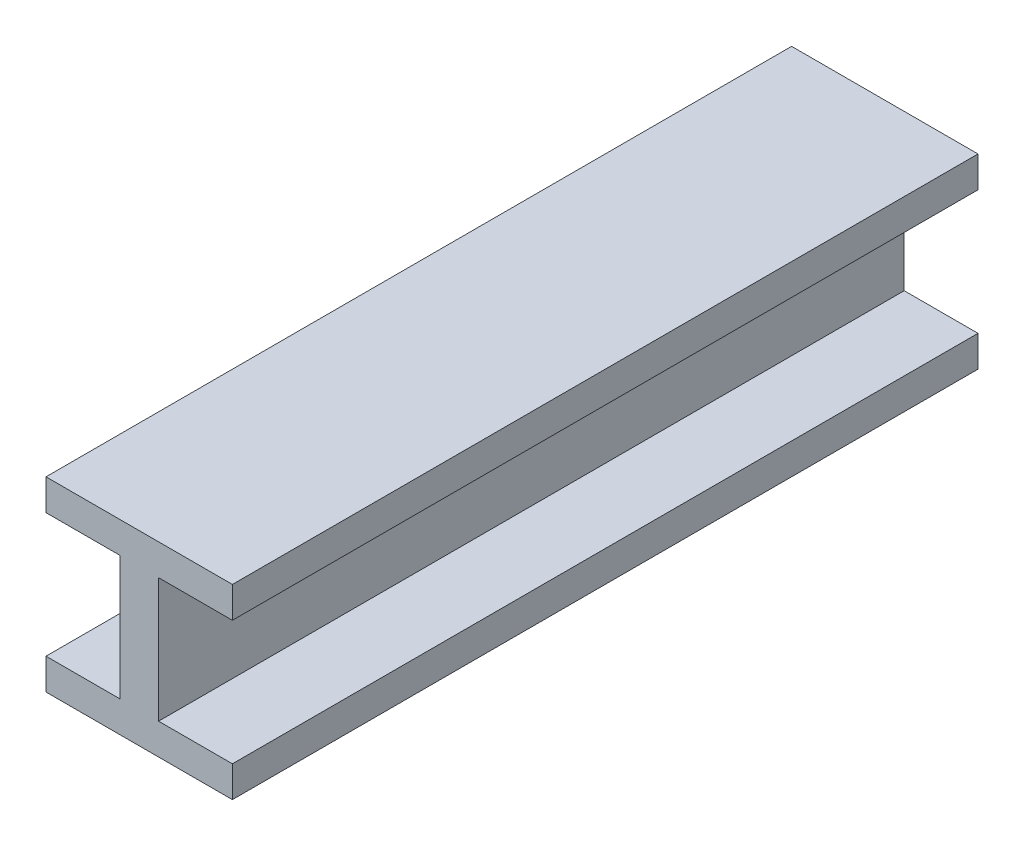
ISO-10303-21;
HEADER;
FILE_DESCRIPTION(('STEP AP214'),'2;1');
FILE_NAME('part.step','',(''),(''),'','','');
FILE_SCHEMA(('AUTOMOTIVE_DESIGN { 1 0 10303 214 1 1 1 1 }'));
ENDSEC;
DATA;
#1=APPLICATION_CONTEXT('core data for automotive mechanical design processes');
#2=APPLICATION_PROTOCOL_DEFINITION('international standard','automotive_design',2000,#1);
#3=PRODUCT_CONTEXT('',#1,'mechanical');
#4=PRODUCT('Part','Part','',(#3));
#5=PRODUCT_RELATED_PRODUCT_CATEGORY('part','',(#4));
#6=PRODUCT_DEFINITION_FORMATION('','',#4);
#7=PRODUCT_DEFINITION_CONTEXT('part definition',#1,'design');
#8=PRODUCT_DEFINITION('design','',#6,#7);
#9=PRODUCT_DEFINITION_SHAPE('','',#8);
#10=(LENGTH_UNIT() NAMED_UNIT(*) SI_UNIT(.MILLI.,.METRE.));
#11=(NAMED_UNIT(*) PLANE_ANGLE_UNIT() SI_UNIT($,.RADIAN.));
#12=(NAMED_UNIT(*) SI_UNIT($,.STERADIAN.) SOLID_ANGLE_UNIT());
#13=UNCERTAINTY_MEASURE_WITH_UNIT(LENGTH_MEASURE(1.E-05),#10,'distance_accuracy_value','');
#14=(GEOMETRIC_REPRESENTATION_CONTEXT(3) GLOBAL_UNCERTAINTY_ASSIGNED_CONTEXT((#13)) GLOBAL_UNIT_ASSIGNED_CONTEXT((#10,
#11,#12)) REPRESENTATION_CONTEXT('',''));
#15=CARTESIAN_POINT('',(0.,0.,0.));
#16=DIRECTION('',(0.,0.,1.));
#17=DIRECTION('',(1.,0.,0.));
#18=AXIS2_PLACEMENT_3D('',#15,#16,#17);
#19=CARTESIAN_POINT('',(-3.96874999999999,12.7,76.2));
#20=DIRECTION('',(0.,1.,0.));
#21=DIRECTION('',(-1.,0.,0.));
#22=AXIS2_PLACEMENT_3D('',#19,#20,#21);
#23=PLANE('',#22);
#24=DIRECTION('',(1.,0.,0.));
#25=VECTOR('',#24,1.);
#26=CARTESIAN_POINT('',(-3.96874999999999,12.7,-76.2));
#27=LINE('',#26,#25);
#28=CARTESIAN_POINT('',(-19.05,12.7,-76.2));
#29=VERTEX_POINT('',#28);
#30=CARTESIAN_POINT('',(-3.96874999999999,12.7,-76.2));
#31=VERTEX_POINT('',#30);
#32=EDGE_CURVE('E154',#29,#31,#27,.T.);
#33=ORIENTED_EDGE('',*,*,#32,.T.);
#34=DIRECTION('',(0.,0.,-1.));
#35=VECTOR('',#34,1.);
#36=CARTESIAN_POINT('',(-3.96874999999999,12.7,76.2));
#37=LINE('',#36,#35);
#38=CARTESIAN_POINT('',(-3.96874999999999,12.7,76.2));
#39=VERTEX_POINT('',#38);
#40=EDGE_CURVE('E11',#39,#31,#37,.T.);
#41=ORIENTED_EDGE('',*,*,#40,.F.);
#42=DIRECTION('',(1.,0.,0.));
#43=VECTOR('',#42,1.);
#44=CARTESIAN_POINT('',(-3.96874999999999,12.7,76.2));
#45=LINE('',#44,#43);
#46=CARTESIAN_POINT('',(-19.05,12.7,76.2));
#47=VERTEX_POINT('',#46);
#48=EDGE_CURVE('E176',#47,#39,#45,.T.);
#49=ORIENTED_EDGE('',*,*,#48,.F.);
#50=DIRECTION('',(0.,0.,-1.));
#51=VECTOR('',#50,1.);
#52=CARTESIAN_POINT('',(-19.05,12.7,76.2));
#53=LINE('',#52,#51);
#54=EDGE_CURVE('E150',#47,#29,#53,.T.);
#55=ORIENTED_EDGE('',*,*,#54,.T.);
#56=EDGE_LOOP('',(#33,#41,#49,#55));
#57=FACE_BOUND('',#56,.T.);
#58=ADVANCED_FACE('F34',(#57),#23,.F.);
#59=CARTESIAN_POINT('',(-3.96874999999999,12.7,76.2));
#60=DIRECTION('',(1.,0.,0.));
#61=DIRECTION('',(0.,0.,-1.));
#62=AXIS2_PLACEMENT_3D('',#59,#60,#61);
#63=PLANE('',#62);
#64=DIRECTION('',(0.,-1.,0.));
#65=VECTOR('',#64,1.);
#66=CARTESIAN_POINT('',(-3.96874999999999,12.7,-76.2));
#67=LINE('',#66,#65);
#68=CARTESIAN_POINT('',(-3.96874999999999,-12.7,-76.2));
#69=VERTEX_POINT('',#68);
#70=EDGE_CURVE('E157',#31,#69,#67,.T.);
#71=ORIENTED_EDGE('',*,*,#70,.T.);
#72=DIRECTION('',(0.,0.,-1.));
#73=VECTOR('',#72,1.);
#74=CARTESIAN_POINT('',(-3.96874999999999,-12.7,76.2));
#75=LINE('',#74,#73);
#76=CARTESIAN_POINT('',(-3.96874999999999,-12.7,76.2));
#77=VERTEX_POINT('',#76);
#78=EDGE_CURVE('E42',#77,#69,#75,.T.);
#79=ORIENTED_EDGE('',*,*,#78,.F.);
#80=DIRECTION('',(0.,-1.,0.));
#81=VECTOR('',#80,1.);
#82=CARTESIAN_POINT('',(-3.96874999999999,12.7,76.2));
#83=LINE('',#82,#81);
#84=EDGE_CURVE('E105',#39,#77,#83,.T.);
#85=ORIENTED_EDGE('',*,*,#84,.F.);
#86=ORIENTED_EDGE('',*,*,#40,.T.);
#87=EDGE_LOOP('',(#71,#79,#85,#86));
#88=FACE_BOUND('',#87,.T.);
#89=ADVANCED_FACE('F254',(#88),#63,.F.);
#90=CARTESIAN_POINT('',(-3.96874999999999,-12.7,76.2));
#91=DIRECTION('',(0.,-1.,0.));
#92=DIRECTION('',(1.,0.,0.));
#93=AXIS2_PLACEMENT_3D('',#90,#91,#92);
#94=PLANE('',#93);
#95=DIRECTION('',(-1.,0.,0.));
#96=VECTOR('',#95,1.);
#97=CARTESIAN_POINT('',(-3.96874999999999,-12.7,-76.2));
#98=LINE('',#97,#96);
#99=CARTESIAN_POINT('',(-19.05,-12.7,-76.2));
#100=VERTEX_POINT('',#99);
#101=EDGE_CURVE('E159',#69,#100,#98,.T.);
#102=ORIENTED_EDGE('',*,*,#101,.T.);
#103=DIRECTION('',(0.,0.,-1.));
#104=VECTOR('',#103,1.);
#105=CARTESIAN_POINT('',(-19.05,-12.7,76.2));
#106=LINE('',#105,#104);
#107=CARTESIAN_POINT('',(-19.05,-12.7,76.2));
#108=VERTEX_POINT('',#107);
#109=EDGE_CURVE('E195',#108,#100,#106,.T.);
#110=ORIENTED_EDGE('',*,*,#109,.F.);
#111=DIRECTION('',(-1.,0.,0.));
#112=VECTOR('',#111,1.);
#113=CARTESIAN_POINT('',(-3.96874999999999,-12.7,76.2));
#114=LINE('',#113,#112);
#115=EDGE_CURVE('E203',#77,#108,#114,.T.);
#116=ORIENTED_EDGE('',*,*,#115,.F.);
#117=ORIENTED_EDGE('',*,*,#78,.T.);
#118=EDGE_LOOP('',(#102,#110,#116,#117));
#119=FACE_BOUND('',#118,.T.);
#120=ADVANCED_FACE('F201',(#119),#94,.F.);
#121=CARTESIAN_POINT('',(-19.05,-12.7,76.2));
#122=DIRECTION('',(1.,0.,0.));
#123=DIRECTION('',(0.,1.,0.));
#124=AXIS2_PLACEMENT_3D('',#121,#122,#123);
#125=PLANE('',#124);
#126=DIRECTION('',(0.,-1.,0.));
#127=VECTOR('',#126,1.);
#128=CARTESIAN_POINT('',(-19.05,-12.7,-76.2));
#129=LINE('',#128,#127);
#130=CARTESIAN_POINT('',(-19.05,-19.05,-76.2));
#131=VERTEX_POINT('',#130);
#132=EDGE_CURVE('E161',#100,#131,#129,.T.);
#133=ORIENTED_EDGE('',*,*,#132,.T.);
#134=DIRECTION('',(0.,0.,-1.));
#135=VECTOR('',#134,1.);
#136=CARTESIAN_POINT('',(-19.05,-19.05,76.2));
#137=LINE('',#136,#135);
#138=CARTESIAN_POINT('',(-19.05,-19.05,76.2));
#139=VERTEX_POINT('',#138);
#140=EDGE_CURVE('E192',#139,#131,#137,.T.);
#141=ORIENTED_EDGE('',*,*,#140,.F.);
#142=DIRECTION('',(0.,-1.,0.));
#143=VECTOR('',#142,1.);
#144=CARTESIAN_POINT('',(-19.05,-12.7,76.2));
#145=LINE('',#144,#143);
#146=EDGE_CURVE('E221',#108,#139,#145,.T.);
#147=ORIENTED_EDGE('',*,*,#146,.F.);
#148=ORIENTED_EDGE('',*,*,#109,.T.);
#149=EDGE_LOOP('',(#133,#141,#147,#148));
#150=FACE_BOUND('',#149,.T.);
#151=ADVANCED_FACE('F212',(#150),#125,.F.);
#152=CARTESIAN_POINT('',(19.05,-19.05,76.2));
#153=DIRECTION('',(0.,1.,0.));
#154=DIRECTION('',(-1.,0.,0.));
#155=AXIS2_PLACEMENT_3D('',#152,#153,#154);
#156=PLANE('',#155);
#157=DIRECTION('',(1.,0.,0.));
#158=VECTOR('',#157,1.);
#159=CARTESIAN_POINT('',(19.05,-19.05,-76.2));
#160=LINE('',#159,#158);
#161=CARTESIAN_POINT('',(19.05,-19.05,-76.2));
#162=VERTEX_POINT('',#161);
#163=EDGE_CURVE('E163',#131,#162,#160,.T.);
#164=ORIENTED_EDGE('',*,*,#163,.T.);
#165=DIRECTION('',(0.,0.,-1.));
#166=VECTOR('',#165,1.);
#167=CARTESIAN_POINT('',(19.05,-19.05,76.2));
#168=LINE('',#167,#166);
#169=CARTESIAN_POINT('',(19.05,-19.05,76.2));
#170=VERTEX_POINT('',#169);
#171=EDGE_CURVE('E189',#170,#162,#168,.T.);
#172=ORIENTED_EDGE('',*,*,#171,.F.);
#173=DIRECTION('',(1.,0.,0.));
#174=VECTOR('',#173,1.);
#175=CARTESIAN_POINT('',(19.05,-19.05,76.2));
#176=LINE('',#175,#174);
#177=EDGE_CURVE('E218',#139,#170,#176,.T.);
#178=ORIENTED_EDGE('',*,*,#177,.F.);
#179=ORIENTED_EDGE('',*,*,#140,.T.);
#180=EDGE_LOOP('',(#164,#172,#178,#179));
#181=FACE_BOUND('',#180,.T.);
#182=ADVANCED_FACE('F216',(#181),#156,.F.);
#183=CARTESIAN_POINT('',(19.05,-12.7,76.2));
#184=DIRECTION('',(-1.,0.,0.));
#185=DIRECTION('',(0.,-1.,0.));
#186=AXIS2_PLACEMENT_3D('',#183,#184,#185);
#187=PLANE('',#186);
#188=DIRECTION('',(0.,1.,0.));
#189=VECTOR('',#188,1.);
#190=CARTESIAN_POINT('',(19.05,-12.7,-76.2));
#191=LINE('',#190,#189);
#192=CARTESIAN_POINT('',(19.05,-12.7,-76.2));
#193=VERTEX_POINT('',#192);
#194=EDGE_CURVE('E165',#162,#193,#191,.T.);
#195=ORIENTED_EDGE('',*,*,#194,.T.);
#196=DIRECTION('',(0.,0.,-1.));
#197=VECTOR('',#196,1.);
#198=CARTESIAN_POINT('',(19.05,-12.7,76.2));
#199=LINE('',#198,#197);
#200=CARTESIAN_POINT('',(19.05,-12.7,76.2));
#201=VERTEX_POINT('',#200);
#202=EDGE_CURVE('E186',#201,#193,#199,.T.);
#203=ORIENTED_EDGE('',*,*,#202,.F.);
#204=DIRECTION('',(0.,1.,0.));
#205=VECTOR('',#204,1.);
#206=CARTESIAN_POINT('',(19.05,-12.7,76.2));
#207=LINE('',#206,#205);
#208=EDGE_CURVE('E220',#170,#201,#207,.T.);
#209=ORIENTED_EDGE('',*,*,#208,.F.);
#210=ORIENTED_EDGE('',*,*,#171,.T.);
#211=EDGE_LOOP('',(#195,#203,#209,#210));
#212=FACE_BOUND('',#211,.T.);
#213=ADVANCED_FACE('F267',(#212),#187,.F.);
#214=CARTESIAN_POINT('',(3.96875000000001,-12.7,76.2));
#215=DIRECTION('',(0.,-1.,0.));
#216=DIRECTION('',(0.,0.,-1.));
#217=AXIS2_PLACEMENT_3D('',#214,#215,#216);
#218=PLANE('',#217);
#219=DIRECTION('',(-1.,0.,0.));
#220=VECTOR('',#219,1.);
#221=CARTESIAN_POINT('',(3.96875000000001,-12.7,-76.2));
#222=LINE('',#221,#220);
#223=CARTESIAN_POINT('',(3.96875000000001,-12.7,-76.2));
#224=VERTEX_POINT('',#223);
#225=EDGE_CURVE('E167',#193,#224,#222,.T.);
#226=ORIENTED_EDGE('',*,*,#225,.T.);
#227=DIRECTION('',(0.,0.,-1.));
#228=VECTOR('',#227,1.);
#229=CARTESIAN_POINT('',(3.96875000000001,-12.7,76.2));
#230=LINE('',#229,#228);
#231=CARTESIAN_POINT('',(3.96875000000001,-12.7,76.2));
#232=VERTEX_POINT('',#231);
#233=EDGE_CURVE('E183',#232,#224,#230,.T.);
#234=ORIENTED_EDGE('',*,*,#233,.F.);
#235=DIRECTION('',(-1.,0.,0.));
#236=VECTOR('',#235,1.);
#237=CARTESIAN_POINT('',(3.96875000000001,-12.7,76.2));
#238=LINE('',#237,#236);
#239=EDGE_CURVE('E223',#201,#232,#238,.T.);
#240=ORIENTED_EDGE('',*,*,#239,.F.);
#241=ORIENTED_EDGE('',*,*,#202,.T.);
#242=EDGE_LOOP('',(#226,#234,#240,#241));
#243=FACE_BOUND('',#242,.T.);
#244=ADVANCED_FACE('F270',(#243),#218,.F.);
#245=CARTESIAN_POINT('',(3.96875,12.7,76.2));
#246=DIRECTION('',(-1.,0.,0.));
#247=DIRECTION('',(0.,-1.,0.));
#248=AXIS2_PLACEMENT_3D('',#245,#246,#247);
#249=PLANE('',#248);
#250=DIRECTION('',(0.,1.,0.));
#251=VECTOR('',#250,1.);
#252=CARTESIAN_POINT('',(3.96875,12.7,-76.2));
#253=LINE('',#252,#251);
#254=CARTESIAN_POINT('',(3.96875,12.7,-76.2));
#255=VERTEX_POINT('',#254);
#256=EDGE_CURVE('E169',#224,#255,#253,.T.);
#257=ORIENTED_EDGE('',*,*,#256,.T.);
#258=DIRECTION('',(0.,0.,-1.));
#259=VECTOR('',#258,1.);
#260=CARTESIAN_POINT('',(3.96875,12.7,76.2));
#261=LINE('',#260,#259);
#262=CARTESIAN_POINT('',(3.96875,12.7,76.2));
#263=VERTEX_POINT('',#262);
#264=EDGE_CURVE('E180',#263,#255,#261,.T.);
#265=ORIENTED_EDGE('',*,*,#264,.F.);
#266=DIRECTION('',(0.,1.,0.));
#267=VECTOR('',#266,1.);
#268=CARTESIAN_POINT('',(3.96875,12.7,76.2));
#269=LINE('',#268,#267);
#270=EDGE_CURVE('E229',#232,#263,#269,.T.);
#271=ORIENTED_EDGE('',*,*,#270,.F.);
#272=ORIENTED_EDGE('',*,*,#233,.T.);
#273=EDGE_LOOP('',(#257,#265,#271,#272));
#274=FACE_BOUND('',#273,.T.);
#275=ADVANCED_FACE('F235',(#274),#249,.F.);
#276=CARTESIAN_POINT('',(3.96875,12.7,76.2));
#277=DIRECTION('',(0.,1.,0.));
#278=DIRECTION('',(-1.,0.,0.));
#279=AXIS2_PLACEMENT_3D('',#276,#277,#278);
#280=PLANE('',#279);
#281=DIRECTION('',(1.,0.,0.));
#282=VECTOR('',#281,1.);
#283=CARTESIAN_POINT('',(3.96875,12.7,-76.2));
#284=LINE('',#283,#282);
#285=CARTESIAN_POINT('',(19.05,12.7,-76.2));
#286=VERTEX_POINT('',#285);
#287=EDGE_CURVE('E171',#255,#286,#284,.T.);
#288=ORIENTED_EDGE('',*,*,#287,.T.);
#289=DIRECTION('',(0.,0.,-1.));
#290=VECTOR('',#289,1.);
#291=CARTESIAN_POINT('',(19.05,12.7,76.2));
#292=LINE('',#291,#290);
#293=CARTESIAN_POINT('',(19.05,12.7,76.2));
#294=VERTEX_POINT('',#293);
#295=EDGE_CURVE('E145',#294,#286,#292,.T.);
#296=ORIENTED_EDGE('',*,*,#295,.F.);
#297=DIRECTION('',(1.,0.,0.));
#298=VECTOR('',#297,1.);
#299=CARTESIAN_POINT('',(3.96875,12.7,76.2));
#300=LINE('',#299,#298);
#301=EDGE_CURVE('E136',#263,#294,#300,.T.);
#302=ORIENTED_EDGE('',*,*,#301,.F.);
#303=ORIENTED_EDGE('',*,*,#264,.T.);
#304=EDGE_LOOP('',(#288,#296,#302,#303));
#305=FACE_BOUND('',#304,.T.);
#306=ADVANCED_FACE('F239',(#305),#280,.F.);
#307=CARTESIAN_POINT('',(19.05,12.7,76.2));
#308=DIRECTION('',(-1.,0.,0.));
#309=DIRECTION('',(0.,-1.,0.));
#310=AXIS2_PLACEMENT_3D('',#307,#308,#309);
#311=PLANE('',#310);
#312=DIRECTION('',(0.,1.,0.));
#313=VECTOR('',#312,1.);
#314=CARTESIAN_POINT('',(19.05,12.7,-76.2));
#315=LINE('',#314,#313);
#316=CARTESIAN_POINT('',(19.05,19.05,-76.2));
#317=VERTEX_POINT('',#316);
#318=EDGE_CURVE('E144',#286,#317,#315,.T.);
#319=ORIENTED_EDGE('',*,*,#318,.T.);
#320=DIRECTION('',(0.,0.,-1.));
#321=VECTOR('',#320,1.);
#322=CARTESIAN_POINT('',(19.05,19.05,76.2));
#323=LINE('',#322,#321);
#324=CARTESIAN_POINT('',(19.05,19.05,76.2));
#325=VERTEX_POINT('',#324);
#326=EDGE_CURVE('E141',#325,#317,#323,.T.);
#327=ORIENTED_EDGE('',*,*,#326,.F.);
#328=DIRECTION('',(0.,1.,0.));
#329=VECTOR('',#328,1.);
#330=CARTESIAN_POINT('',(19.05,12.7,76.2));
#331=LINE('',#330,#329);
#332=EDGE_CURVE('E130',#294,#325,#331,.T.);
#333=ORIENTED_EDGE('',*,*,#332,.F.);
#334=ORIENTED_EDGE('',*,*,#295,.T.);
#335=EDGE_LOOP('',(#319,#327,#333,#334));
#336=FACE_BOUND('',#335,.T.);
#337=ADVANCED_FACE('F142',(#336),#311,.F.);
#338=CARTESIAN_POINT('',(19.05,19.05,76.2));
#339=DIRECTION('',(0.,-1.,0.));
#340=DIRECTION('',(1.,0.,0.));
#341=AXIS2_PLACEMENT_3D('',#338,#339,#340);
#342=PLANE('',#341);
#343=DIRECTION('',(-1.,0.,0.));
#344=VECTOR('',#343,1.);
#345=CARTESIAN_POINT('',(19.05,19.05,-76.2));
#346=LINE('',#345,#344);
#347=CARTESIAN_POINT('',(-19.05,19.05,-76.2));
#348=VERTEX_POINT('',#347);
#349=EDGE_CURVE('E91',#317,#348,#346,.T.);
#350=ORIENTED_EDGE('',*,*,#349,.T.);
#351=DIRECTION('',(0.,0.,-1.));
#352=VECTOR('',#351,1.);
#353=CARTESIAN_POINT('',(-19.05,19.05,76.2));
#354=LINE('',#353,#352);
#355=CARTESIAN_POINT('',(-19.05,19.05,76.2));
#356=VERTEX_POINT('',#355);
#357=EDGE_CURVE('E146',#356,#348,#354,.T.);
#358=ORIENTED_EDGE('',*,*,#357,.F.);
#359=DIRECTION('',(-1.,0.,0.));
#360=VECTOR('',#359,1.);
#361=CARTESIAN_POINT('',(19.05,19.05,76.2));
#362=LINE('',#361,#360);
#363=EDGE_CURVE('E134',#325,#356,#362,.T.);
#364=ORIENTED_EDGE('',*,*,#363,.F.);
#365=ORIENTED_EDGE('',*,*,#326,.T.);
#366=EDGE_LOOP('',(#350,#358,#364,#365));
#367=FACE_BOUND('',#366,.T.);
#368=ADVANCED_FACE('F148',(#367),#342,.F.);
#369=CARTESIAN_POINT('',(-19.05,12.7,76.2));
#370=DIRECTION('',(1.,0.,0.));
#371=DIRECTION('',(0.,1.,0.));
#372=AXIS2_PLACEMENT_3D('',#369,#370,#371);
#373=PLANE('',#372);
#374=DIRECTION('',(0.,-1.,0.));
#375=VECTOR('',#374,1.);
#376=CARTESIAN_POINT('',(-19.05,12.7,-76.2));
#377=LINE('',#376,#375);
#378=EDGE_CURVE('E97',#348,#29,#377,.T.);
#379=ORIENTED_EDGE('',*,*,#378,.T.);
#380=ORIENTED_EDGE('',*,*,#54,.F.);
#381=DIRECTION('',(0.,-1.,0.));
#382=VECTOR('',#381,1.);
#383=CARTESIAN_POINT('',(-19.05,12.7,76.2));
#384=LINE('',#383,#382);
#385=EDGE_CURVE('E50',#356,#47,#384,.T.);
#386=ORIENTED_EDGE('',*,*,#385,.F.);
#387=ORIENTED_EDGE('',*,*,#357,.T.);
#388=EDGE_LOOP('',(#379,#380,#386,#387));
#389=FACE_BOUND('',#388,.T.);
#390=ADVANCED_FACE('F243',(#389),#373,.F.);
#391=CARTESIAN_POINT('',(0.,0.,76.2));
#392=DIRECTION('',(0.,0.,-1.));
#393=DIRECTION('',(-1.,0.,0.));
#394=AXIS2_PLACEMENT_3D('',#391,#392,#393);
#395=PLANE('',#394);
#396=ORIENTED_EDGE('',*,*,#48,.T.);
#397=ORIENTED_EDGE('',*,*,#84,.T.);
#398=ORIENTED_EDGE('',*,*,#115,.T.);
#399=ORIENTED_EDGE('',*,*,#146,.T.);
#400=ORIENTED_EDGE('',*,*,#177,.T.);
#401=ORIENTED_EDGE('',*,*,#208,.T.);
#402=ORIENTED_EDGE('',*,*,#239,.T.);
#403=ORIENTED_EDGE('',*,*,#270,.T.);
#404=ORIENTED_EDGE('',*,*,#301,.T.);
#405=ORIENTED_EDGE('',*,*,#332,.T.);
#406=ORIENTED_EDGE('',*,*,#363,.T.);
#407=ORIENTED_EDGE('',*,*,#385,.T.);
#408=EDGE_LOOP('',(#396,#397,#398,#399,#400,#401,#402,#403,#404,#405,#406,#407));
#409=FACE_BOUND('',#408,.T.);
#410=ADVANCED_FACE('F132',(#409),#395,.F.);
#411=CARTESIAN_POINT('',(0.,0.,-76.2));
#412=DIRECTION('',(0.,0.,-1.));
#413=DIRECTION('',(-1.,0.,0.));
#414=AXIS2_PLACEMENT_3D('',#411,#412,#413);
#415=PLANE('',#414);
#416=ORIENTED_EDGE('',*,*,#32,.F.);
#417=ORIENTED_EDGE('',*,*,#378,.F.);
#418=ORIENTED_EDGE('',*,*,#349,.F.);
#419=ORIENTED_EDGE('',*,*,#318,.F.);
#420=ORIENTED_EDGE('',*,*,#287,.F.);
#421=ORIENTED_EDGE('',*,*,#256,.F.);
#422=ORIENTED_EDGE('',*,*,#225,.F.);
#423=ORIENTED_EDGE('',*,*,#194,.F.);
#424=ORIENTED_EDGE('',*,*,#163,.F.);
#425=ORIENTED_EDGE('',*,*,#132,.F.);
#426=ORIENTED_EDGE('',*,*,#101,.F.);
#427=ORIENTED_EDGE('',*,*,#70,.F.);
#428=EDGE_LOOP('',(#416,#417,#418,#419,#420,#421,#422,#423,#424,#425,#426,#427));
#429=FACE_BOUND('',#428,.T.);
#430=ADVANCED_FACE('F207',(#429),#415,.T.);
#431=CLOSED_SHELL('',(#58,#89,#120,#151,#182,#213,#244,#275,#306,#337,#368,#390,#410,#430));
#432=MANIFOLD_SOLID_BREP('B2',#431);
#433=ADVANCED_BREP_SHAPE_REPRESENTATION('',(#18,#432),#14);
#434=SHAPE_DEFINITION_REPRESENTATION(#9,#433);
ENDSEC;
END-ISO-10303-21;
